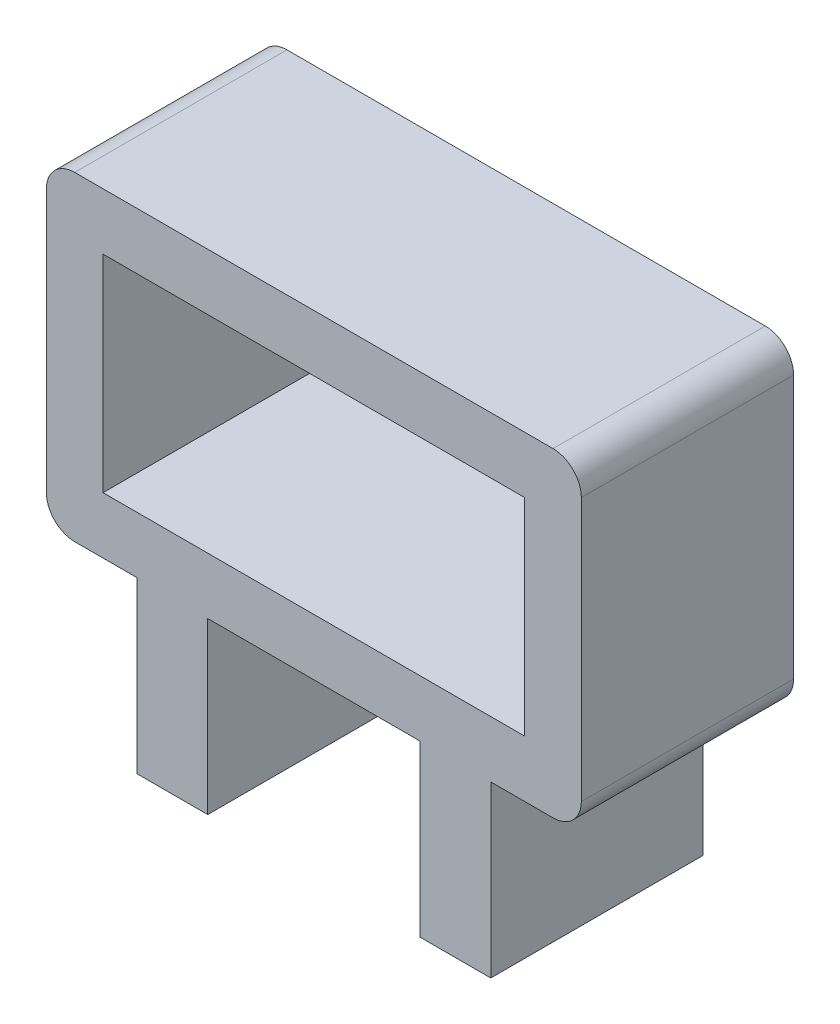
ISO-10303-21;
HEADER;
FILE_DESCRIPTION(('STEP AP214'),'2;1');
FILE_NAME('part.step','',(''),(''),'','','');
FILE_SCHEMA(('AUTOMOTIVE_DESIGN { 1 0 10303 214 1 1 1 1 }'));
ENDSEC;
DATA;
#1=APPLICATION_CONTEXT('core data for automotive mechanical design processes');
#2=APPLICATION_PROTOCOL_DEFINITION('international standard','automotive_design',2000,#1);
#3=PRODUCT_CONTEXT('',#1,'mechanical');
#4=PRODUCT('Part','Part','',(#3));
#5=PRODUCT_RELATED_PRODUCT_CATEGORY('part','',(#4));
#6=PRODUCT_DEFINITION_FORMATION('','',#4);
#7=PRODUCT_DEFINITION_CONTEXT('part definition',#1,'design');
#8=PRODUCT_DEFINITION('design','',#6,#7);
#9=PRODUCT_DEFINITION_SHAPE('','',#8);
#10=(LENGTH_UNIT() NAMED_UNIT(*) SI_UNIT(.MILLI.,.METRE.));
#11=(NAMED_UNIT(*) PLANE_ANGLE_UNIT() SI_UNIT($,.RADIAN.));
#12=(NAMED_UNIT(*) SI_UNIT($,.STERADIAN.) SOLID_ANGLE_UNIT());
#13=UNCERTAINTY_MEASURE_WITH_UNIT(LENGTH_MEASURE(1.E-05),#10,'distance_accuracy_value','');
#14=(GEOMETRIC_REPRESENTATION_CONTEXT(3) GLOBAL_UNCERTAINTY_ASSIGNED_CONTEXT((#13)) GLOBAL_UNIT_ASSIGNED_CONTEXT((#10,
#11,#12)) REPRESENTATION_CONTEXT('',''));
#15=CARTESIAN_POINT('',(0.,0.,0.));
#16=DIRECTION('',(0.,0.,1.));
#17=DIRECTION('',(1.,0.,0.));
#18=AXIS2_PLACEMENT_3D('',#15,#16,#17);
#19=CARTESIAN_POINT('',(0.,0.,15.));
#20=DIRECTION('',(0.,0.,-1.));
#21=DIRECTION('',(-1.,0.,0.));
#22=AXIS2_PLACEMENT_3D('',#19,#20,#21);
#23=PLANE('',#22);
#24=DIRECTION('',(0.,-1.,0.));
#25=VECTOR('',#24,1.);
#26=CARTESIAN_POINT('',(-36.1047171963891,20.4370103244966,15.));
#27=LINE('',#26,#25);
#28=CARTESIAN_POINT('',(-36.1047171963891,18.4370103244966,15.));
#29=VERTEX_POINT('',#28);
#30=CARTESIAN_POINT('',(-36.1047171963891,-0.162989675503388,15.));
#31=VERTEX_POINT('',#30);
#32=EDGE_CURVE('E220',#29,#31,#27,.T.);
#33=ORIENTED_EDGE('',*,*,#32,.T.);
#34=CARTESIAN_POINT('',(-34.1047171963891,-0.162989675503388,15.));
#35=DIRECTION('',(0.,0.,-1.));
#36=DIRECTION('',(-1.,0.,0.));
#37=AXIS2_PLACEMENT_3D('',#34,#35,#36);
#38=CIRCLE('',#37,2.);
#39=CARTESIAN_POINT('',(-34.1047171963891,-2.16298967550339,15.));
#40=VERTEX_POINT('',#39);
#41=EDGE_CURVE('E309',#31,#40,#38,.F.);
#42=ORIENTED_EDGE('',*,*,#41,.T.);
#43=DIRECTION('',(1.,0.,0.));
#44=VECTOR('',#43,1.);
#45=CARTESIAN_POINT('',(-36.1047171963891,-2.16298967550339,15.));
#46=LINE('',#45,#44);
#47=CARTESIAN_POINT('',(-29.7047171963891,-2.16298967550339,15.));
#48=VERTEX_POINT('',#47);
#49=EDGE_CURVE('E223',#40,#48,#46,.T.);
#50=ORIENTED_EDGE('',*,*,#49,.T.);
#51=DIRECTION('',(0.,-1.,0.));
#52=VECTOR('',#51,1.);
#53=CARTESIAN_POINT('',(-29.7047171963891,-14.1629896755034,15.));
#54=LINE('',#53,#52);
#55=CARTESIAN_POINT('',(-29.7047171963891,-14.1629896755034,15.));
#56=VERTEX_POINT('',#55);
#57=EDGE_CURVE('E225',#48,#56,#54,.T.);
#58=ORIENTED_EDGE('',*,*,#57,.T.);
#59=DIRECTION('',(1.,0.,0.));
#60=VECTOR('',#59,1.);
#61=CARTESIAN_POINT('',(-24.7047171963891,-14.1629896755034,15.));
#62=LINE('',#61,#60);
#63=CARTESIAN_POINT('',(-24.7047171963891,-14.1629896755034,15.));
#64=VERTEX_POINT('',#63);
#65=EDGE_CURVE('E227',#56,#64,#62,.T.);
#66=ORIENTED_EDGE('',*,*,#65,.T.);
#67=DIRECTION('',(0.,1.,0.));
#68=VECTOR('',#67,1.);
#69=CARTESIAN_POINT('',(-24.7047171963891,-2.16298967550339,15.));
#70=LINE('',#69,#68);
#71=CARTESIAN_POINT('',(-24.7047171963891,-2.16298967550339,15.));
#72=VERTEX_POINT('',#71);
#73=EDGE_CURVE('E229',#64,#72,#70,.T.);
#74=ORIENTED_EDGE('',*,*,#73,.T.);
#75=DIRECTION('',(1.,0.,0.));
#76=VECTOR('',#75,1.);
#77=CARTESIAN_POINT('',(-24.7047171963891,-2.16298967550339,15.));
#78=LINE('',#77,#76);
#79=CARTESIAN_POINT('',(-9.70471719638909,-2.16298967550338,15.));
#80=VERTEX_POINT('',#79);
#81=EDGE_CURVE('E231',#72,#80,#78,.T.);
#82=ORIENTED_EDGE('',*,*,#81,.T.);
#83=DIRECTION('',(0.,-1.,0.));
#84=VECTOR('',#83,1.);
#85=CARTESIAN_POINT('',(-9.70471719638909,-2.16298967550338,15.));
#86=LINE('',#85,#84);
#87=CARTESIAN_POINT('',(-9.70471719638909,-14.1629896755034,15.));
#88=VERTEX_POINT('',#87);
#89=EDGE_CURVE('E233',#80,#88,#86,.T.);
#90=ORIENTED_EDGE('',*,*,#89,.T.);
#91=DIRECTION('',(1.,0.,0.));
#92=VECTOR('',#91,1.);
#93=CARTESIAN_POINT('',(-9.70471719638909,-14.1629896755034,15.));
#94=LINE('',#93,#92);
#95=CARTESIAN_POINT('',(-4.70471719638909,-14.1629896755034,15.));
#96=VERTEX_POINT('',#95);
#97=EDGE_CURVE('E235',#88,#96,#94,.T.);
#98=ORIENTED_EDGE('',*,*,#97,.T.);
#99=DIRECTION('',(0.,1.,0.));
#100=VECTOR('',#99,1.);
#101=CARTESIAN_POINT('',(-4.70471719638909,-14.1629896755034,15.));
#102=LINE('',#101,#100);
#103=CARTESIAN_POINT('',(-4.70471719638909,-2.16298967550338,15.));
#104=VERTEX_POINT('',#103);
#105=EDGE_CURVE('E237',#96,#104,#102,.T.);
#106=ORIENTED_EDGE('',*,*,#105,.T.);
#107=DIRECTION('',(1.,0.,0.));
#108=VECTOR('',#107,1.);
#109=CARTESIAN_POINT('',(-4.70471719638909,-2.16298967550338,15.));
#110=LINE('',#109,#108);
#111=CARTESIAN_POINT('',(-0.304717196389079,-2.16298967550339,15.));
#112=VERTEX_POINT('',#111);
#113=EDGE_CURVE('E212',#104,#112,#110,.T.);
#114=ORIENTED_EDGE('',*,*,#113,.T.);
#115=CARTESIAN_POINT('',(-0.304717196389075,-0.162989675503388,15.));
#116=DIRECTION('',(0.,0.,-1.));
#117=DIRECTION('',(-1.,0.,0.));
#118=AXIS2_PLACEMENT_3D('',#115,#116,#117);
#119=CIRCLE('',#118,2.);
#120=CARTESIAN_POINT('',(1.69528280361092,-0.162989675503388,15.));
#121=VERTEX_POINT('',#120);
#122=EDGE_CURVE('E307',#112,#121,#119,.F.);
#123=ORIENTED_EDGE('',*,*,#122,.T.);
#124=DIRECTION('',(0.,1.,0.));
#125=VECTOR('',#124,1.);
#126=CARTESIAN_POINT('',(1.69528280361092,20.4370103244966,15.));
#127=LINE('',#126,#125);
#128=CARTESIAN_POINT('',(1.69528280361092,18.4370103244966,15.));
#129=VERTEX_POINT('',#128);
#130=EDGE_CURVE('E215',#121,#129,#127,.T.);
#131=ORIENTED_EDGE('',*,*,#130,.T.);
#132=CARTESIAN_POINT('',(-0.304717196389082,18.4370103244966,15.));
#133=DIRECTION('',(0.,0.,-1.));
#134=DIRECTION('',(-1.,0.,0.));
#135=AXIS2_PLACEMENT_3D('',#132,#133,#134);
#136=CIRCLE('',#135,2.);
#137=CARTESIAN_POINT('',(-0.304717196389082,20.4370103244966,15.));
#138=VERTEX_POINT('',#137);
#139=EDGE_CURVE('E53',#129,#138,#136,.F.);
#140=ORIENTED_EDGE('',*,*,#139,.T.);
#141=DIRECTION('',(-1.,0.,0.));
#142=VECTOR('',#141,1.);
#143=CARTESIAN_POINT('',(-36.1047171963891,20.4370103244966,15.));
#144=LINE('',#143,#142);
#145=CARTESIAN_POINT('',(-34.1047171963891,20.4370103244966,15.));
#146=VERTEX_POINT('',#145);
#147=EDGE_CURVE('E218',#138,#146,#144,.T.);
#148=ORIENTED_EDGE('',*,*,#147,.T.);
#149=CARTESIAN_POINT('',(-34.1047171963891,18.4370103244966,15.));
#150=DIRECTION('',(0.,0.,-1.));
#151=DIRECTION('',(-1.,0.,0.));
#152=AXIS2_PLACEMENT_3D('',#149,#150,#151);
#153=CIRCLE('',#152,2.);
#154=EDGE_CURVE('E305',#146,#29,#153,.F.);
#155=ORIENTED_EDGE('',*,*,#154,.T.);
#156=EDGE_LOOP('',(#33,#42,#50,#58,#66,#74,#82,#90,#98,#106,#114,#123,#131,#140,#148,#155));
#157=FACE_BOUND('',#156,.T.);
#158=DIRECTION('',(0.,1.,0.));
#159=VECTOR('',#158,1.);
#160=CARTESIAN_POINT('',(-2.30471719638909,16.4370103244966,15.));
#161=LINE('',#160,#159);
#162=CARTESIAN_POINT('',(-2.30471719638909,1.83701032449662,15.));
#163=VERTEX_POINT('',#162);
#164=CARTESIAN_POINT('',(-2.30471719638909,16.4370103244966,15.));
#165=VERTEX_POINT('',#164);
#166=EDGE_CURVE('E171',#163,#165,#161,.T.);
#167=ORIENTED_EDGE('',*,*,#166,.F.);
#168=DIRECTION('',(1.,0.,0.));
#169=VECTOR('',#168,1.);
#170=CARTESIAN_POINT('',(-32.1047171963891,1.83701032449662,15.));
#171=LINE('',#170,#169);
#172=CARTESIAN_POINT('',(-32.1047171963891,1.83701032449662,15.));
#173=VERTEX_POINT('',#172);
#174=EDGE_CURVE('E196',#173,#163,#171,.T.);
#175=ORIENTED_EDGE('',*,*,#174,.F.);
#176=DIRECTION('',(0.,-1.,0.));
#177=VECTOR('',#176,1.);
#178=CARTESIAN_POINT('',(-32.1047171963891,16.4370103244966,15.));
#179=LINE('',#178,#177);
#180=CARTESIAN_POINT('',(-32.1047171963891,16.4370103244966,15.));
#181=VERTEX_POINT('',#180);
#182=EDGE_CURVE('E194',#181,#173,#179,.T.);
#183=ORIENTED_EDGE('',*,*,#182,.F.);
#184=DIRECTION('',(-1.,0.,0.));
#185=VECTOR('',#184,1.);
#186=CARTESIAN_POINT('',(-32.1047171963891,16.4370103244966,15.));
#187=LINE('',#186,#185);
#188=EDGE_CURVE('E181',#165,#181,#187,.T.);
#189=ORIENTED_EDGE('',*,*,#188,.F.);
#190=EDGE_LOOP('',(#167,#175,#183,#189));
#191=FACE_BOUND('',#190,.T.);
#192=ADVANCED_FACE('F33',(#157,#191),#23,.F.);
#193=CARTESIAN_POINT('',(0.,0.,0.));
#194=DIRECTION('',(0.,0.,-1.));
#195=DIRECTION('',(-1.,0.,0.));
#196=AXIS2_PLACEMENT_3D('',#193,#194,#195);
#197=PLANE('',#196);
#198=DIRECTION('',(1.,0.,0.));
#199=VECTOR('',#198,1.);
#200=CARTESIAN_POINT('',(-36.1047171963891,-2.16298967550339,0.));
#201=LINE('',#200,#199);
#202=CARTESIAN_POINT('',(-34.1047171963891,-2.16298967550339,0.));
#203=VERTEX_POINT('',#202);
#204=CARTESIAN_POINT('',(-29.7047171963891,-2.16298967550339,0.));
#205=VERTEX_POINT('',#204);
#206=EDGE_CURVE('E250',#203,#205,#201,.T.);
#207=ORIENTED_EDGE('',*,*,#206,.F.);
#208=CARTESIAN_POINT('',(-34.1047171963891,-0.162989675503388,0.));
#209=DIRECTION('',(0.,0.,-1.));
#210=DIRECTION('',(-1.,0.,0.));
#211=AXIS2_PLACEMENT_3D('',#208,#209,#210);
#212=CIRCLE('',#211,2.);
#213=CARTESIAN_POINT('',(-36.1047171963891,-0.162989675503388,0.));
#214=VERTEX_POINT('',#213);
#215=EDGE_CURVE('E297',#203,#214,#212,.T.);
#216=ORIENTED_EDGE('',*,*,#215,.T.);
#217=DIRECTION('',(0.,-1.,0.));
#218=VECTOR('',#217,1.);
#219=CARTESIAN_POINT('',(-36.1047171963891,20.4370103244966,0.));
#220=LINE('',#219,#218);
#221=CARTESIAN_POINT('',(-36.1047171963891,18.4370103244966,0.));
#222=VERTEX_POINT('',#221);
#223=EDGE_CURVE('E247',#222,#214,#220,.T.);
#224=ORIENTED_EDGE('',*,*,#223,.F.);
#225=CARTESIAN_POINT('',(-34.1047171963891,18.4370103244966,0.));
#226=DIRECTION('',(0.,0.,-1.));
#227=DIRECTION('',(-1.,0.,0.));
#228=AXIS2_PLACEMENT_3D('',#225,#226,#227);
#229=CIRCLE('',#228,2.);
#230=CARTESIAN_POINT('',(-34.1047171963891,20.4370103244966,0.));
#231=VERTEX_POINT('',#230);
#232=EDGE_CURVE('E293',#222,#231,#229,.T.);
#233=ORIENTED_EDGE('',*,*,#232,.T.);
#234=DIRECTION('',(-1.,0.,0.));
#235=VECTOR('',#234,1.);
#236=CARTESIAN_POINT('',(-36.1047171963891,20.4370103244966,0.));
#237=LINE('',#236,#235);
#238=CARTESIAN_POINT('',(-0.304717196389082,20.4370103244966,0.));
#239=VERTEX_POINT('',#238);
#240=EDGE_CURVE('E245',#239,#231,#237,.T.);
#241=ORIENTED_EDGE('',*,*,#240,.F.);
#242=CARTESIAN_POINT('',(-0.304717196389082,18.4370103244966,0.));
#243=DIRECTION('',(0.,0.,-1.));
#244=DIRECTION('',(-1.,0.,0.));
#245=AXIS2_PLACEMENT_3D('',#242,#243,#244);
#246=CIRCLE('',#245,2.);
#247=CARTESIAN_POINT('',(1.69528280361092,18.4370103244966,0.));
#248=VERTEX_POINT('',#247);
#249=EDGE_CURVE('E291',#239,#248,#246,.T.);
#250=ORIENTED_EDGE('',*,*,#249,.T.);
#251=DIRECTION('',(0.,1.,0.));
#252=VECTOR('',#251,1.);
#253=CARTESIAN_POINT('',(1.69528280361092,20.4370103244966,0.));
#254=LINE('',#253,#252);
#255=CARTESIAN_POINT('',(1.69528280361092,-0.162989675503388,0.));
#256=VERTEX_POINT('',#255);
#257=EDGE_CURVE('E242',#256,#248,#254,.T.);
#258=ORIENTED_EDGE('',*,*,#257,.F.);
#259=CARTESIAN_POINT('',(-0.304717196389075,-0.162989675503388,0.));
#260=DIRECTION('',(0.,0.,-1.));
#261=DIRECTION('',(-1.,0.,0.));
#262=AXIS2_PLACEMENT_3D('',#259,#260,#261);
#263=CIRCLE('',#262,2.);
#264=CARTESIAN_POINT('',(-0.304717196389079,-2.16298967550339,0.));
#265=VERTEX_POINT('',#264);
#266=EDGE_CURVE('E295',#256,#265,#263,.T.);
#267=ORIENTED_EDGE('',*,*,#266,.T.);
#268=DIRECTION('',(1.,0.,0.));
#269=VECTOR('',#268,1.);
#270=CARTESIAN_POINT('',(-4.70471719638909,-2.16298967550338,0.));
#271=LINE('',#270,#269);
#272=CARTESIAN_POINT('',(-4.70471719638909,-2.16298967550338,0.));
#273=VERTEX_POINT('',#272);
#274=EDGE_CURVE('E189',#273,#265,#271,.T.);
#275=ORIENTED_EDGE('',*,*,#274,.F.);
#276=DIRECTION('',(0.,1.,0.));
#277=VECTOR('',#276,1.);
#278=CARTESIAN_POINT('',(-4.70471719638909,-14.1629896755034,0.));
#279=LINE('',#278,#277);
#280=CARTESIAN_POINT('',(-4.70471719638909,-14.1629896755034,0.));
#281=VERTEX_POINT('',#280);
#282=EDGE_CURVE('E216',#281,#273,#279,.T.);
#283=ORIENTED_EDGE('',*,*,#282,.F.);
#284=DIRECTION('',(1.,0.,0.));
#285=VECTOR('',#284,1.);
#286=CARTESIAN_POINT('',(-9.70471719638909,-14.1629896755034,0.));
#287=LINE('',#286,#285);
#288=CARTESIAN_POINT('',(-9.70471719638909,-14.1629896755034,0.));
#289=VERTEX_POINT('',#288);
#290=EDGE_CURVE('E262',#289,#281,#287,.T.);
#291=ORIENTED_EDGE('',*,*,#290,.F.);
#292=DIRECTION('',(0.,-1.,0.));
#293=VECTOR('',#292,1.);
#294=CARTESIAN_POINT('',(-9.70471719638909,-2.16298967550338,0.));
#295=LINE('',#294,#293);
#296=CARTESIAN_POINT('',(-9.70471719638909,-2.16298967550338,0.));
#297=VERTEX_POINT('',#296);
#298=EDGE_CURVE('E260',#297,#289,#295,.T.);
#299=ORIENTED_EDGE('',*,*,#298,.F.);
#300=DIRECTION('',(1.,0.,0.));
#301=VECTOR('',#300,1.);
#302=CARTESIAN_POINT('',(-24.7047171963891,-2.16298967550339,0.));
#303=LINE('',#302,#301);
#304=CARTESIAN_POINT('',(-24.7047171963891,-2.16298967550339,0.));
#305=VERTEX_POINT('',#304);
#306=EDGE_CURVE('E258',#305,#297,#303,.T.);
#307=ORIENTED_EDGE('',*,*,#306,.F.);
#308=DIRECTION('',(0.,1.,0.));
#309=VECTOR('',#308,1.);
#310=CARTESIAN_POINT('',(-24.7047171963891,-2.16298967550339,0.));
#311=LINE('',#310,#309);
#312=CARTESIAN_POINT('',(-24.7047171963891,-14.1629896755034,0.));
#313=VERTEX_POINT('',#312);
#314=EDGE_CURVE('E256',#313,#305,#311,.T.);
#315=ORIENTED_EDGE('',*,*,#314,.F.);
#316=DIRECTION('',(1.,0.,0.));
#317=VECTOR('',#316,1.);
#318=CARTESIAN_POINT('',(-24.7047171963891,-14.1629896755034,0.));
#319=LINE('',#318,#317);
#320=CARTESIAN_POINT('',(-29.7047171963891,-14.1629896755034,0.));
#321=VERTEX_POINT('',#320);
#322=EDGE_CURVE('E254',#321,#313,#319,.T.);
#323=ORIENTED_EDGE('',*,*,#322,.F.);
#324=DIRECTION('',(0.,-1.,0.));
#325=VECTOR('',#324,1.);
#326=CARTESIAN_POINT('',(-29.7047171963891,-14.1629896755034,0.));
#327=LINE('',#326,#325);
#328=EDGE_CURVE('E252',#205,#321,#327,.T.);
#329=ORIENTED_EDGE('',*,*,#328,.F.);
#330=EDGE_LOOP('',(#207,#216,#224,#233,#241,#250,#258,#267,#275,#283,#291,#299,#307,#315,#323,#329));
#331=FACE_BOUND('',#330,.T.);
#332=DIRECTION('',(1.,0.,0.));
#333=VECTOR('',#332,1.);
#334=CARTESIAN_POINT('',(-32.1047171963891,1.83701032449662,0.));
#335=LINE('',#334,#333);
#336=CARTESIAN_POINT('',(-32.1047171963891,1.83701032449662,0.));
#337=VERTEX_POINT('',#336);
#338=CARTESIAN_POINT('',(-2.30471719638909,1.83701032449662,0.));
#339=VERTEX_POINT('',#338);
#340=EDGE_CURVE('E182',#337,#339,#335,.T.);
#341=ORIENTED_EDGE('',*,*,#340,.T.);
#342=DIRECTION('',(0.,1.,0.));
#343=VECTOR('',#342,1.);
#344=CARTESIAN_POINT('',(-2.30471719638909,16.4370103244966,0.));
#345=LINE('',#344,#343);
#346=CARTESIAN_POINT('',(-2.30471719638909,16.4370103244966,0.));
#347=VERTEX_POINT('',#346);
#348=EDGE_CURVE('E200',#339,#347,#345,.T.);
#349=ORIENTED_EDGE('',*,*,#348,.T.);
#350=DIRECTION('',(-1.,0.,0.));
#351=VECTOR('',#350,1.);
#352=CARTESIAN_POINT('',(-32.1047171963891,16.4370103244966,0.));
#353=LINE('',#352,#351);
#354=CARTESIAN_POINT('',(-32.1047171963891,16.4370103244966,0.));
#355=VERTEX_POINT('',#354);
#356=EDGE_CURVE('E188',#347,#355,#353,.T.);
#357=ORIENTED_EDGE('',*,*,#356,.T.);
#358=DIRECTION('',(0.,-1.,0.));
#359=VECTOR('',#358,1.);
#360=CARTESIAN_POINT('',(-32.1047171963891,16.4370103244966,0.));
#361=LINE('',#360,#359);
#362=EDGE_CURVE('E203',#355,#337,#361,.T.);
#363=ORIENTED_EDGE('',*,*,#362,.T.);
#364=EDGE_LOOP('',(#341,#349,#357,#363));
#365=FACE_BOUND('',#364,.T.);
#366=ADVANCED_FACE('F324',(#331,#365),#197,.T.);
#367=CARTESIAN_POINT('',(-4.70471719638909,-2.16298967550338,15.));
#368=DIRECTION('',(0.,1.,0.));
#369=DIRECTION('',(-1.,0.,0.));
#370=AXIS2_PLACEMENT_3D('',#367,#368,#369);
#371=PLANE('',#370);
#372=ORIENTED_EDGE('',*,*,#274,.T.);
#373=DIRECTION('',(0.,0.,-1.));
#374=VECTOR('',#373,1.);
#375=CARTESIAN_POINT('',(-0.304717196389077,-2.16298967550339,15.));
#376=LINE('',#375,#374);
#377=EDGE_CURVE('E316',#265,#112,#376,.F.);
#378=ORIENTED_EDGE('',*,*,#377,.T.);
#379=ORIENTED_EDGE('',*,*,#113,.F.);
#380=DIRECTION('',(0.,0.,-1.));
#381=VECTOR('',#380,1.);
#382=CARTESIAN_POINT('',(-4.70471719638909,-2.16298967550338,15.));
#383=LINE('',#382,#381);
#384=EDGE_CURVE('E239',#104,#273,#383,.T.);
#385=ORIENTED_EDGE('',*,*,#384,.T.);
#386=EDGE_LOOP('',(#372,#378,#379,#385));
#387=FACE_BOUND('',#386,.T.);
#388=ADVANCED_FACE('F382',(#387),#371,.F.);
#389=CARTESIAN_POINT('',(1.69528280361092,20.4370103244966,15.));
#390=DIRECTION('',(-1.,0.,0.));
#391=DIRECTION('',(0.,-1.,0.));
#392=AXIS2_PLACEMENT_3D('',#389,#390,#391);
#393=PLANE('',#392);
#394=ORIENTED_EDGE('',*,*,#130,.F.);
#395=DIRECTION('',(0.,0.,-1.));
#396=VECTOR('',#395,1.);
#397=CARTESIAN_POINT('',(1.69528280361092,-0.162989675503388,15.));
#398=LINE('',#397,#396);
#399=EDGE_CURVE('E313',#121,#256,#398,.T.);
#400=ORIENTED_EDGE('',*,*,#399,.T.);
#401=ORIENTED_EDGE('',*,*,#257,.T.);
#402=DIRECTION('',(0.,0.,-1.));
#403=VECTOR('',#402,1.);
#404=CARTESIAN_POINT('',(1.69528280361092,18.4370103244966,15.));
#405=LINE('',#404,#403);
#406=EDGE_CURVE('E311',#248,#129,#405,.F.);
#407=ORIENTED_EDGE('',*,*,#406,.T.);
#408=EDGE_LOOP('',(#394,#400,#401,#407));
#409=FACE_BOUND('',#408,.T.);
#410=ADVANCED_FACE('F390',(#409),#393,.F.);
#411=CARTESIAN_POINT('',(-36.1047171963891,20.4370103244966,15.));
#412=DIRECTION('',(0.,-1.,0.));
#413=DIRECTION('',(0.,0.,-1.));
#414=AXIS2_PLACEMENT_3D('',#411,#412,#413);
#415=PLANE('',#414);
#416=ORIENTED_EDGE('',*,*,#240,.T.);
#417=DIRECTION('',(0.,0.,-1.));
#418=VECTOR('',#417,1.);
#419=CARTESIAN_POINT('',(-34.1047171963891,20.4370103244966,15.));
#420=LINE('',#419,#418);
#421=EDGE_CURVE('E11',#231,#146,#420,.F.);
#422=ORIENTED_EDGE('',*,*,#421,.T.);
#423=ORIENTED_EDGE('',*,*,#147,.F.);
#424=DIRECTION('',(0.,0.,-1.));
#425=VECTOR('',#424,1.);
#426=CARTESIAN_POINT('',(-0.304717196389082,20.4370103244966,15.));
#427=LINE('',#426,#425);
#428=EDGE_CURVE('E41',#138,#239,#427,.T.);
#429=ORIENTED_EDGE('',*,*,#428,.T.);
#430=EDGE_LOOP('',(#416,#422,#423,#429));
#431=FACE_BOUND('',#430,.T.);
#432=ADVANCED_FACE('F320',(#431),#415,.F.);
#433=CARTESIAN_POINT('',(-36.1047171963891,20.4370103244966,15.));
#434=DIRECTION('',(1.,0.,0.));
#435=DIRECTION('',(0.,1.,0.));
#436=AXIS2_PLACEMENT_3D('',#433,#434,#435);
#437=PLANE('',#436);
#438=ORIENTED_EDGE('',*,*,#223,.T.);
#439=DIRECTION('',(0.,0.,-1.));
#440=VECTOR('',#439,1.);
#441=CARTESIAN_POINT('',(-36.1047171963891,-0.162989675503388,15.));
#442=LINE('',#441,#440);
#443=EDGE_CURVE('E302',#214,#31,#442,.F.);
#444=ORIENTED_EDGE('',*,*,#443,.T.);
#445=ORIENTED_EDGE('',*,*,#32,.F.);
#446=DIRECTION('',(0.,0.,-1.));
#447=VECTOR('',#446,1.);
#448=CARTESIAN_POINT('',(-36.1047171963891,18.4370103244966,15.));
#449=LINE('',#448,#447);
#450=EDGE_CURVE('E299',#29,#222,#449,.T.);
#451=ORIENTED_EDGE('',*,*,#450,.T.);
#452=EDGE_LOOP('',(#438,#444,#445,#451));
#453=FACE_BOUND('',#452,.T.);
#454=ADVANCED_FACE('F334',(#453),#437,.F.);
#455=CARTESIAN_POINT('',(-36.1047171963891,-2.16298967550339,15.));
#456=DIRECTION('',(0.,1.,0.));
#457=DIRECTION('',(-1.,0.,0.));
#458=AXIS2_PLACEMENT_3D('',#455,#456,#457);
#459=PLANE('',#458);
#460=ORIENTED_EDGE('',*,*,#49,.F.);
#461=DIRECTION('',(0.,0.,-1.));
#462=VECTOR('',#461,1.);
#463=CARTESIAN_POINT('',(-34.1047171963891,-2.16298967550339,15.));
#464=LINE('',#463,#462);
#465=EDGE_CURVE('E288',#40,#203,#464,.T.);
#466=ORIENTED_EDGE('',*,*,#465,.T.);
#467=ORIENTED_EDGE('',*,*,#206,.T.);
#468=DIRECTION('',(0.,0.,-1.));
#469=VECTOR('',#468,1.);
#470=CARTESIAN_POINT('',(-29.7047171963891,-2.16298967550339,15.));
#471=LINE('',#470,#469);
#472=EDGE_CURVE('E285',#48,#205,#471,.T.);
#473=ORIENTED_EDGE('',*,*,#472,.F.);
#474=EDGE_LOOP('',(#460,#466,#467,#473));
#475=FACE_BOUND('',#474,.T.);
#476=ADVANCED_FACE('F342',(#475),#459,.F.);
#477=CARTESIAN_POINT('',(-29.7047171963891,-14.1629896755034,15.));
#478=DIRECTION('',(1.,0.,0.));
#479=DIRECTION('',(0.,0.,-1.));
#480=AXIS2_PLACEMENT_3D('',#477,#478,#479);
#481=PLANE('',#480);
#482=ORIENTED_EDGE('',*,*,#328,.T.);
#483=DIRECTION('',(0.,0.,-1.));
#484=VECTOR('',#483,1.);
#485=CARTESIAN_POINT('',(-29.7047171963891,-14.1629896755034,15.));
#486=LINE('',#485,#484);
#487=EDGE_CURVE('E282',#56,#321,#486,.T.);
#488=ORIENTED_EDGE('',*,*,#487,.F.);
#489=ORIENTED_EDGE('',*,*,#57,.F.);
#490=ORIENTED_EDGE('',*,*,#472,.T.);
#491=EDGE_LOOP('',(#482,#488,#489,#490));
#492=FACE_BOUND('',#491,.T.);
#493=ADVANCED_FACE('F349',(#492),#481,.F.);
#494=CARTESIAN_POINT('',(-24.7047171963891,-14.1629896755034,15.));
#495=DIRECTION('',(0.,1.,0.));
#496=DIRECTION('',(0.,0.,1.));
#497=AXIS2_PLACEMENT_3D('',#494,#495,#496);
#498=PLANE('',#497);
#499=ORIENTED_EDGE('',*,*,#322,.T.);
#500=DIRECTION('',(0.,0.,-1.));
#501=VECTOR('',#500,1.);
#502=CARTESIAN_POINT('',(-24.7047171963891,-14.1629896755034,15.));
#503=LINE('',#502,#501);
#504=EDGE_CURVE('E279',#64,#313,#503,.T.);
#505=ORIENTED_EDGE('',*,*,#504,.F.);
#506=ORIENTED_EDGE('',*,*,#65,.F.);
#507=ORIENTED_EDGE('',*,*,#487,.T.);
#508=EDGE_LOOP('',(#499,#505,#506,#507));
#509=FACE_BOUND('',#508,.T.);
#510=ADVANCED_FACE('F353',(#509),#498,.F.);
#511=CARTESIAN_POINT('',(-24.7047171963891,-2.16298967550339,15.));
#512=DIRECTION('',(-1.,0.,0.));
#513=DIRECTION('',(0.,0.,1.));
#514=AXIS2_PLACEMENT_3D('',#511,#512,#513);
#515=PLANE('',#514);
#516=ORIENTED_EDGE('',*,*,#314,.T.);
#517=DIRECTION('',(0.,0.,-1.));
#518=VECTOR('',#517,1.);
#519=CARTESIAN_POINT('',(-24.7047171963891,-2.16298967550339,15.));
#520=LINE('',#519,#518);
#521=EDGE_CURVE('E276',#72,#305,#520,.T.);
#522=ORIENTED_EDGE('',*,*,#521,.F.);
#523=ORIENTED_EDGE('',*,*,#73,.F.);
#524=ORIENTED_EDGE('',*,*,#504,.T.);
#525=EDGE_LOOP('',(#516,#522,#523,#524));
#526=FACE_BOUND('',#525,.T.);
#527=ADVANCED_FACE('F360',(#526),#515,.F.);
#528=CARTESIAN_POINT('',(-24.7047171963891,-2.16298967550339,15.));
#529=DIRECTION('',(0.,1.,0.));
#530=DIRECTION('',(-1.,0.,0.));
#531=AXIS2_PLACEMENT_3D('',#528,#529,#530);
#532=PLANE('',#531);
#533=ORIENTED_EDGE('',*,*,#306,.T.);
#534=DIRECTION('',(0.,0.,-1.));
#535=VECTOR('',#534,1.);
#536=CARTESIAN_POINT('',(-9.70471719638909,-2.16298967550338,15.));
#537=LINE('',#536,#535);
#538=EDGE_CURVE('E273',#80,#297,#537,.T.);
#539=ORIENTED_EDGE('',*,*,#538,.F.);
#540=ORIENTED_EDGE('',*,*,#81,.F.);
#541=ORIENTED_EDGE('',*,*,#521,.T.);
#542=EDGE_LOOP('',(#533,#539,#540,#541));
#543=FACE_BOUND('',#542,.T.);
#544=ADVANCED_FACE('F363',(#543),#532,.F.);
#545=CARTESIAN_POINT('',(-9.70471719638909,-2.16298967550338,15.));
#546=DIRECTION('',(1.,0.,0.));
#547=DIRECTION('',(0.,1.,0.));
#548=AXIS2_PLACEMENT_3D('',#545,#546,#547);
#549=PLANE('',#548);
#550=ORIENTED_EDGE('',*,*,#298,.T.);
#551=DIRECTION('',(0.,0.,-1.));
#552=VECTOR('',#551,1.);
#553=CARTESIAN_POINT('',(-9.70471719638909,-14.1629896755034,15.));
#554=LINE('',#553,#552);
#555=EDGE_CURVE('E270',#88,#289,#554,.T.);
#556=ORIENTED_EDGE('',*,*,#555,.F.);
#557=ORIENTED_EDGE('',*,*,#89,.F.);
#558=ORIENTED_EDGE('',*,*,#538,.T.);
#559=EDGE_LOOP('',(#550,#556,#557,#558));
#560=FACE_BOUND('',#559,.T.);
#561=ADVANCED_FACE('F368',(#560),#549,.F.);
#562=CARTESIAN_POINT('',(-9.70471719638909,-14.1629896755034,15.));
#563=DIRECTION('',(0.,1.,0.));
#564=DIRECTION('',(0.,0.,1.));
#565=AXIS2_PLACEMENT_3D('',#562,#563,#564);
#566=PLANE('',#565);
#567=ORIENTED_EDGE('',*,*,#290,.T.);
#568=DIRECTION('',(0.,0.,-1.));
#569=VECTOR('',#568,1.);
#570=CARTESIAN_POINT('',(-4.70471719638909,-14.1629896755034,15.));
#571=LINE('',#570,#569);
#572=EDGE_CURVE('E267',#96,#281,#571,.T.);
#573=ORIENTED_EDGE('',*,*,#572,.F.);
#574=ORIENTED_EDGE('',*,*,#97,.F.);
#575=ORIENTED_EDGE('',*,*,#555,.T.);
#576=EDGE_LOOP('',(#567,#573,#574,#575));
#577=FACE_BOUND('',#576,.T.);
#578=ADVANCED_FACE('F374',(#577),#566,.F.);
#579=CARTESIAN_POINT('',(-4.70471719638909,-14.1629896755034,15.));
#580=DIRECTION('',(-1.,0.,0.));
#581=DIRECTION('',(0.,0.,1.));
#582=AXIS2_PLACEMENT_3D('',#579,#580,#581);
#583=PLANE('',#582);
#584=ORIENTED_EDGE('',*,*,#282,.T.);
#585=ORIENTED_EDGE('',*,*,#384,.F.);
#586=ORIENTED_EDGE('',*,*,#105,.F.);
#587=ORIENTED_EDGE('',*,*,#572,.T.);
#588=EDGE_LOOP('',(#584,#585,#586,#587));
#589=FACE_BOUND('',#588,.T.);
#590=ADVANCED_FACE('F378',(#589),#583,.F.);
#591=CARTESIAN_POINT('',(-2.30471719638909,16.4370103244966,15.));
#592=DIRECTION('',(-1.,0.,0.));
#593=DIRECTION('',(0.,-1.,0.));
#594=AXIS2_PLACEMENT_3D('',#591,#592,#593);
#595=PLANE('',#594);
#596=ORIENTED_EDGE('',*,*,#348,.F.);
#597=DIRECTION('',(0.,0.,-1.));
#598=VECTOR('',#597,1.);
#599=CARTESIAN_POINT('',(-2.30471719638909,1.83701032449662,15.));
#600=LINE('',#599,#598);
#601=EDGE_CURVE('E177',#163,#339,#600,.T.);
#602=ORIENTED_EDGE('',*,*,#601,.F.);
#603=ORIENTED_EDGE('',*,*,#166,.T.);
#604=DIRECTION('',(0.,0.,-1.));
#605=VECTOR('',#604,1.);
#606=CARTESIAN_POINT('',(-2.30471719638909,16.4370103244966,15.));
#607=LINE('',#606,#605);
#608=EDGE_CURVE('E174',#165,#347,#607,.T.);
#609=ORIENTED_EDGE('',*,*,#608,.T.);
#610=EDGE_LOOP('',(#596,#602,#603,#609));
#611=FACE_BOUND('',#610,.T.);
#612=ADVANCED_FACE('F173',(#611),#595,.T.);
#613=CARTESIAN_POINT('',(-32.1047171963891,16.4370103244966,15.));
#614=DIRECTION('',(0.,-1.,0.));
#615=DIRECTION('',(0.,0.,-1.));
#616=AXIS2_PLACEMENT_3D('',#613,#614,#615);
#617=PLANE('',#616);
#618=ORIENTED_EDGE('',*,*,#356,.F.);
#619=ORIENTED_EDGE('',*,*,#608,.F.);
#620=ORIENTED_EDGE('',*,*,#188,.T.);
#621=DIRECTION('',(0.,0.,-1.));
#622=VECTOR('',#621,1.);
#623=CARTESIAN_POINT('',(-32.1047171963891,16.4370103244966,15.));
#624=LINE('',#623,#622);
#625=EDGE_CURVE('E190',#181,#355,#624,.T.);
#626=ORIENTED_EDGE('',*,*,#625,.T.);
#627=EDGE_LOOP('',(#618,#619,#620,#626));
#628=FACE_BOUND('',#627,.T.);
#629=ADVANCED_FACE('F185',(#628),#617,.T.);
#630=CARTESIAN_POINT('',(-32.1047171963891,16.4370103244966,15.));
#631=DIRECTION('',(1.,0.,0.));
#632=DIRECTION('',(0.,0.,-1.));
#633=AXIS2_PLACEMENT_3D('',#630,#631,#632);
#634=PLANE('',#633);
#635=ORIENTED_EDGE('',*,*,#362,.F.);
#636=ORIENTED_EDGE('',*,*,#625,.F.);
#637=ORIENTED_EDGE('',*,*,#182,.T.);
#638=DIRECTION('',(0.,0.,-1.));
#639=VECTOR('',#638,1.);
#640=CARTESIAN_POINT('',(-32.1047171963891,1.83701032449662,15.));
#641=LINE('',#640,#639);
#642=EDGE_CURVE('E209',#173,#337,#641,.T.);
#643=ORIENTED_EDGE('',*,*,#642,.T.);
#644=EDGE_LOOP('',(#635,#636,#637,#643));
#645=FACE_BOUND('',#644,.T.);
#646=ADVANCED_FACE('F462',(#645),#634,.T.);
#647=CARTESIAN_POINT('',(-32.1047171963891,1.83701032449662,15.));
#648=DIRECTION('',(0.,1.,0.));
#649=DIRECTION('',(0.,0.,1.));
#650=AXIS2_PLACEMENT_3D('',#647,#648,#649);
#651=PLANE('',#650);
#652=ORIENTED_EDGE('',*,*,#340,.F.);
#653=ORIENTED_EDGE('',*,*,#642,.F.);
#654=ORIENTED_EDGE('',*,*,#174,.T.);
#655=ORIENTED_EDGE('',*,*,#601,.T.);
#656=EDGE_LOOP('',(#652,#653,#654,#655));
#657=FACE_BOUND('',#656,.T.);
#658=ADVANCED_FACE('F431',(#657),#651,.T.);
#659=CARTESIAN_POINT('',(-34.1047171963891,-0.162989675503388,15.));
#660=DIRECTION('',(0.,0.,-1.));
#661=DIRECTION('',(-1.,0.,0.));
#662=AXIS2_PLACEMENT_3D('',#659,#660,#661);
#663=CYLINDRICAL_SURFACE('',#662,2.);
#664=ORIENTED_EDGE('',*,*,#41,.F.);
#665=ORIENTED_EDGE('',*,*,#443,.F.);
#666=ORIENTED_EDGE('',*,*,#215,.F.);
#667=ORIENTED_EDGE('',*,*,#465,.F.);
#668=EDGE_LOOP('',(#664,#665,#666,#667));
#669=FACE_BOUND('',#668,.T.);
#670=ADVANCED_FACE('F340',(#669),#663,.T.);
#671=CARTESIAN_POINT('',(-0.304717196389075,-0.162989675503388,15.));
#672=DIRECTION('',(0.,0.,-1.));
#673=DIRECTION('',(-1.,0.,0.));
#674=AXIS2_PLACEMENT_3D('',#671,#672,#673);
#675=CYLINDRICAL_SURFACE('',#674,2.);
#676=ORIENTED_EDGE('',*,*,#122,.F.);
#677=ORIENTED_EDGE('',*,*,#377,.F.);
#678=ORIENTED_EDGE('',*,*,#266,.F.);
#679=ORIENTED_EDGE('',*,*,#399,.F.);
#680=EDGE_LOOP('',(#676,#677,#678,#679));
#681=FACE_BOUND('',#680,.T.);
#682=ADVANCED_FACE('F388',(#681),#675,.T.);
#683=CARTESIAN_POINT('',(-34.1047171963891,18.4370103244966,15.));
#684=DIRECTION('',(0.,0.,-1.));
#685=DIRECTION('',(-1.,0.,0.));
#686=AXIS2_PLACEMENT_3D('',#683,#684,#685);
#687=CYLINDRICAL_SURFACE('',#686,2.);
#688=ORIENTED_EDGE('',*,*,#154,.F.);
#689=ORIENTED_EDGE('',*,*,#421,.F.);
#690=ORIENTED_EDGE('',*,*,#232,.F.);
#691=ORIENTED_EDGE('',*,*,#450,.F.);
#692=EDGE_LOOP('',(#688,#689,#690,#691));
#693=FACE_BOUND('',#692,.T.);
#694=ADVANCED_FACE('F331',(#693),#687,.T.);
#695=CARTESIAN_POINT('',(-0.304717196389082,18.4370103244966,15.));
#696=DIRECTION('',(0.,0.,-1.));
#697=DIRECTION('',(-1.,0.,0.));
#698=AXIS2_PLACEMENT_3D('',#695,#696,#697);
#699=CYLINDRICAL_SURFACE('',#698,2.);
#700=ORIENTED_EDGE('',*,*,#139,.F.);
#701=ORIENTED_EDGE('',*,*,#406,.F.);
#702=ORIENTED_EDGE('',*,*,#249,.F.);
#703=ORIENTED_EDGE('',*,*,#428,.F.);
#704=EDGE_LOOP('',(#700,#701,#702,#703));
#705=FACE_BOUND('',#704,.T.);
#706=ADVANCED_FACE('F35',(#705),#699,.T.);
#707=CLOSED_SHELL('',(#192,#366,#388,#410,#432,#454,#476,#493,#510,#527,#544,#561,#578,#590,
#612,#629,#646,#658,#670,#682,#694,#706));
#708=MANIFOLD_SOLID_BREP('B2',#707);
#709=ADVANCED_BREP_SHAPE_REPRESENTATION('',(#18,#708),#14);
#710=SHAPE_DEFINITION_REPRESENTATION(#9,#709);
ENDSEC;
END-ISO-10303-21;
